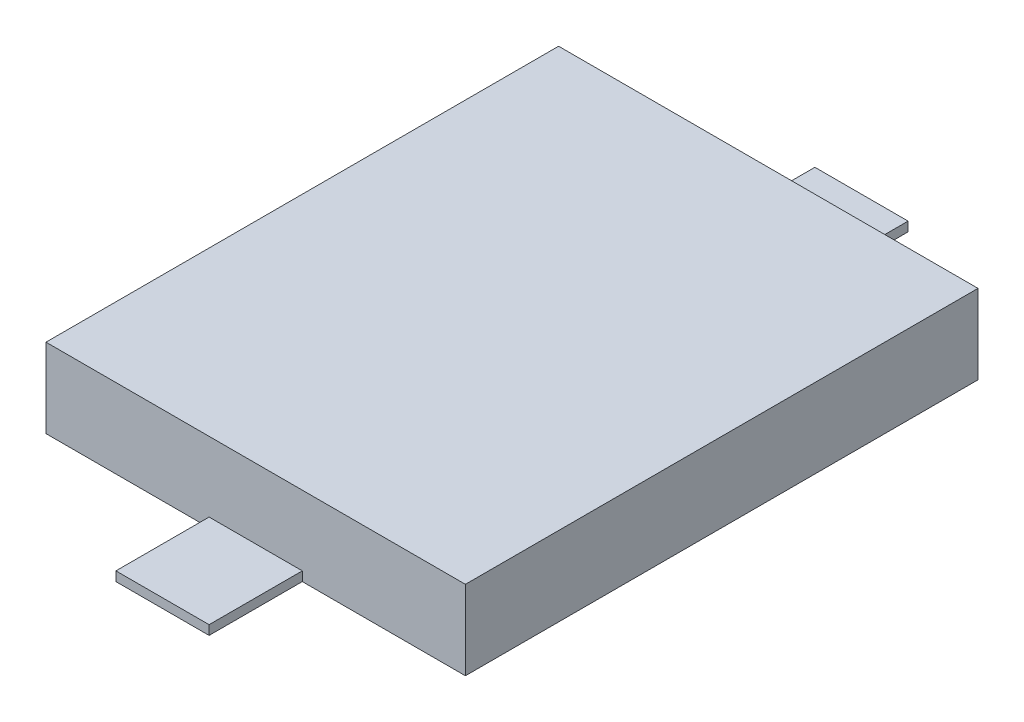
ISO-10303-21;
HEADER;
FILE_DESCRIPTION(('STEP AP214'),'2;1');
FILE_NAME('part.step','',(''),(''),'','','');
FILE_SCHEMA(('AUTOMOTIVE_DESIGN { 1 0 10303 214 1 1 1 1 }'));
ENDSEC;
DATA;
#1=APPLICATION_CONTEXT('core data for automotive mechanical design processes');
#2=APPLICATION_PROTOCOL_DEFINITION('international standard','automotive_design',2000,#1);
#3=PRODUCT_CONTEXT('',#1,'mechanical');
#4=PRODUCT('Part','Part','',(#3));
#5=PRODUCT_RELATED_PRODUCT_CATEGORY('part','',(#4));
#6=PRODUCT_DEFINITION_FORMATION('','',#4);
#7=PRODUCT_DEFINITION_CONTEXT('part definition',#1,'design');
#8=PRODUCT_DEFINITION('design','',#6,#7);
#9=PRODUCT_DEFINITION_SHAPE('','',#8);
#10=(LENGTH_UNIT() NAMED_UNIT(*) SI_UNIT(.MILLI.,.METRE.));
#11=(NAMED_UNIT(*) PLANE_ANGLE_UNIT() SI_UNIT($,.RADIAN.));
#12=(NAMED_UNIT(*) SI_UNIT($,.STERADIAN.) SOLID_ANGLE_UNIT());
#13=UNCERTAINTY_MEASURE_WITH_UNIT(LENGTH_MEASURE(1.E-05),#10,'distance_accuracy_value','');
#14=(GEOMETRIC_REPRESENTATION_CONTEXT(3) GLOBAL_UNCERTAINTY_ASSIGNED_CONTEXT((#13)) GLOBAL_UNIT_ASSIGNED_CONTEXT((#10,
#11,#12)) REPRESENTATION_CONTEXT('',''));
#15=CARTESIAN_POINT('',(0.,0.,0.));
#16=DIRECTION('',(0.,0.,1.));
#17=DIRECTION('',(1.,0.,0.));
#18=AXIS2_PLACEMENT_3D('',#15,#16,#17);
#19=CARTESIAN_POINT('',(-1.,0.2,-7.5));
#20=CARTESIAN_POINT('',(1.,0.2,-7.5));
#21=CARTESIAN_POINT('',(-1.,0.2,-5.5));
#22=CARTESIAN_POINT('',(1.,0.2,-5.5));
#23=(BOUNDED_SURFACE() B_SPLINE_SURFACE(1,1,((#19,#20),(#21,#22)),.UNSPECIFIED.,.F.,.F.,
.F.) B_SPLINE_SURFACE_WITH_KNOTS((2,2),(2,2),(-7.5,-5.5),(-1.,1.),
.UNSPECIFIED.) GEOMETRIC_REPRESENTATION_ITEM() RATIONAL_B_SPLINE_SURFACE(((1.,1.),(1.,1.))) REPRESENTATION_ITEM('') SURFACE());
#24=CARTESIAN_POINT('',(1.,0.2,-7.5));
#25=CARTESIAN_POINT('',(1.,0.2,-5.5));
#26=(BOUNDED_CURVE() B_SPLINE_CURVE(1,(#24,#25),.UNSPECIFIED.,.F.,
.F.) B_SPLINE_CURVE_WITH_KNOTS((2,2),(0.,2.),
.UNSPECIFIED.) CURVE() GEOMETRIC_REPRESENTATION_ITEM() RATIONAL_B_SPLINE_CURVE((1.,1.)) REPRESENTATION_ITEM(''));
#27=CARTESIAN_POINT('',(1.,0.2,-7.5));
#28=VERTEX_POINT('',#27);
#29=CARTESIAN_POINT('',(1.,0.2,-5.5));
#30=VERTEX_POINT('',#29);
#31=EDGE_CURVE('E211',#28,#30,#26,.T.);
#32=CARTESIAN_POINT('',(-1.,0.2,-7.5));
#33=CARTESIAN_POINT('',(1.,0.2,-7.5));
#34=(BOUNDED_CURVE() B_SPLINE_CURVE(1,(#32,#33),.UNSPECIFIED.,.F.,
.F.) B_SPLINE_CURVE_WITH_KNOTS((2,2),(0.,2.),
.UNSPECIFIED.) CURVE() GEOMETRIC_REPRESENTATION_ITEM() RATIONAL_B_SPLINE_CURVE((1.,1.)) REPRESENTATION_ITEM(''));
#35=CARTESIAN_POINT('',(-1.,0.2,-7.5));
#36=VERTEX_POINT('',#35);
#37=EDGE_CURVE('E32',#36,#28,#34,.T.);
#38=CARTESIAN_POINT('',(-1.,0.2,-5.5));
#39=CARTESIAN_POINT('',(-1.,0.2,-7.5));
#40=(BOUNDED_CURVE() B_SPLINE_CURVE(1,(#38,#39),.UNSPECIFIED.,.F.,
.F.) B_SPLINE_CURVE_WITH_KNOTS((2,2),(-2.,0.),
.UNSPECIFIED.) CURVE() GEOMETRIC_REPRESENTATION_ITEM() RATIONAL_B_SPLINE_CURVE((1.,1.)) REPRESENTATION_ITEM(''));
#41=CARTESIAN_POINT('',(-1.,0.2,-5.5));
#42=VERTEX_POINT('',#41);
#43=EDGE_CURVE('E11',#42,#36,#40,.T.);
#44=CARTESIAN_POINT('',(1.,0.2,-5.5));
#45=CARTESIAN_POINT('',(-1.,0.2,-5.5));
#46=(BOUNDED_CURVE() B_SPLINE_CURVE(1,(#44,#45),.UNSPECIFIED.,.F.,
.F.) B_SPLINE_CURVE_WITH_KNOTS((2,2),(-2.,0.),
.UNSPECIFIED.) CURVE() GEOMETRIC_REPRESENTATION_ITEM() RATIONAL_B_SPLINE_CURVE((1.,1.)) REPRESENTATION_ITEM(''));
#47=EDGE_CURVE('E23',#30,#42,#46,.T.);
#48=ORIENTED_EDGE('',*,*,#31,.F.);
#49=ORIENTED_EDGE('',*,*,#37,.F.);
#50=ORIENTED_EDGE('',*,*,#43,.F.);
#51=ORIENTED_EDGE('',*,*,#47,.F.);
#52=EDGE_LOOP('',(#48,#49,#50,#51));
#53=FACE_BOUND('',#52,.T.);
#54=ADVANCED_FACE('F17',(#53),#23,.T.);
#55=CARTESIAN_POINT('',(-1.,0.,-7.5));
#56=CARTESIAN_POINT('',(-1.,0.2,-7.5));
#57=CARTESIAN_POINT('',(-1.,0.,-5.5));
#58=CARTESIAN_POINT('',(-1.,0.2,-5.5));
#59=(BOUNDED_SURFACE() B_SPLINE_SURFACE(1,1,((#55,#56),(#57,#58)),.UNSPECIFIED.,.F.,.F.,
.F.) B_SPLINE_SURFACE_WITH_KNOTS((2,2),(2,2),(0.,2.),(-0.2,0.),
.UNSPECIFIED.) GEOMETRIC_REPRESENTATION_ITEM() RATIONAL_B_SPLINE_SURFACE(((1.,1.),(1.,1.))) REPRESENTATION_ITEM('') SURFACE());
#60=CARTESIAN_POINT('',(-1.,0.,-5.5));
#61=CARTESIAN_POINT('',(-1.,0.,-7.5));
#62=(BOUNDED_CURVE() B_SPLINE_CURVE(1,(#60,#61),.UNSPECIFIED.,.F.,
.F.) B_SPLINE_CURVE_WITH_KNOTS((2,2),(-2.,0.),
.UNSPECIFIED.) CURVE() GEOMETRIC_REPRESENTATION_ITEM() RATIONAL_B_SPLINE_CURVE((1.,1.)) REPRESENTATION_ITEM(''));
#63=CARTESIAN_POINT('',(-1.,0.,-5.5));
#64=VERTEX_POINT('',#63);
#65=CARTESIAN_POINT('',(-1.,0.,-7.5));
#66=VERTEX_POINT('',#65);
#67=EDGE_CURVE('E155',#64,#66,#62,.T.);
#68=CARTESIAN_POINT('',(-1.,0.2,-5.5));
#69=CARTESIAN_POINT('',(-1.,0.,-5.5));
#70=(BOUNDED_CURVE() B_SPLINE_CURVE(1,(#68,#69),.UNSPECIFIED.,.F.,
.F.) B_SPLINE_CURVE_WITH_KNOTS((2,2),(0.,0.2),
.UNSPECIFIED.) CURVE() GEOMETRIC_REPRESENTATION_ITEM() RATIONAL_B_SPLINE_CURVE((1.,1.)) REPRESENTATION_ITEM(''));
#71=EDGE_CURVE('E159',#42,#64,#70,.T.);
#72=CARTESIAN_POINT('',(-1.,0.2,-7.5));
#73=CARTESIAN_POINT('',(-1.,0.,-7.5));
#74=(BOUNDED_CURVE() B_SPLINE_CURVE(1,(#72,#73),.UNSPECIFIED.,.F.,
.F.) B_SPLINE_CURVE_WITH_KNOTS((2,2),(0.,0.2),
.UNSPECIFIED.) CURVE() GEOMETRIC_REPRESENTATION_ITEM() RATIONAL_B_SPLINE_CURVE((1.,1.)) REPRESENTATION_ITEM(''));
#75=EDGE_CURVE('E162',#36,#66,#74,.T.);
#76=ORIENTED_EDGE('',*,*,#67,.F.);
#77=ORIENTED_EDGE('',*,*,#71,.F.);
#78=ORIENTED_EDGE('',*,*,#43,.T.);
#79=ORIENTED_EDGE('',*,*,#75,.T.);
#80=EDGE_LOOP('',(#76,#77,#78,#79));
#81=FACE_BOUND('',#80,.T.);
#82=ADVANCED_FACE('F157',(#81),#59,.T.);
#83=CARTESIAN_POINT('',(1.,0.,-7.5));
#84=CARTESIAN_POINT('',(1.,0.2,-7.5));
#85=CARTESIAN_POINT('',(-1.,0.,-7.5));
#86=CARTESIAN_POINT('',(-1.,0.2,-7.5));
#87=(BOUNDED_SURFACE() B_SPLINE_SURFACE(1,1,((#83,#84),(#85,#86)),.UNSPECIFIED.,.F.,.F.,
.F.) B_SPLINE_SURFACE_WITH_KNOTS((2,2),(2,2),(-2.,0.),(-0.2,0.),
.UNSPECIFIED.) GEOMETRIC_REPRESENTATION_ITEM() RATIONAL_B_SPLINE_SURFACE(((1.,1.),(1.,1.))) REPRESENTATION_ITEM('') SURFACE());
#88=CARTESIAN_POINT('',(-1.,0.,-7.5));
#89=CARTESIAN_POINT('',(1.,0.,-7.5));
#90=(BOUNDED_CURVE() B_SPLINE_CURVE(1,(#88,#89),.UNSPECIFIED.,.F.,
.F.) B_SPLINE_CURVE_WITH_KNOTS((2,2),(0.,2.),
.UNSPECIFIED.) CURVE() GEOMETRIC_REPRESENTATION_ITEM() RATIONAL_B_SPLINE_CURVE((1.,1.)) REPRESENTATION_ITEM(''));
#91=CARTESIAN_POINT('',(1.,0.,-7.5));
#92=VERTEX_POINT('',#91);
#93=EDGE_CURVE('E167',#66,#92,#90,.T.);
#94=CARTESIAN_POINT('',(1.,0.2,-7.5));
#95=CARTESIAN_POINT('',(1.,0.,-7.5));
#96=(BOUNDED_CURVE() B_SPLINE_CURVE(1,(#94,#95),.UNSPECIFIED.,.F.,
.F.) B_SPLINE_CURVE_WITH_KNOTS((2,2),(0.,0.2),
.UNSPECIFIED.) CURVE() GEOMETRIC_REPRESENTATION_ITEM() RATIONAL_B_SPLINE_CURVE((1.,1.)) REPRESENTATION_ITEM(''));
#97=EDGE_CURVE('E219',#28,#92,#96,.T.);
#98=ORIENTED_EDGE('',*,*,#93,.F.);
#99=ORIENTED_EDGE('',*,*,#75,.F.);
#100=ORIENTED_EDGE('',*,*,#37,.T.);
#101=ORIENTED_EDGE('',*,*,#97,.T.);
#102=EDGE_LOOP('',(#98,#99,#100,#101));
#103=FACE_BOUND('',#102,.T.);
#104=ADVANCED_FACE('F486',(#103),#87,.T.);
#105=CARTESIAN_POINT('',(1.,0.,-5.5));
#106=CARTESIAN_POINT('',(1.,0.2,-5.5));
#107=CARTESIAN_POINT('',(1.,0.,-7.5));
#108=CARTESIAN_POINT('',(1.,0.2,-7.5));
#109=(BOUNDED_SURFACE() B_SPLINE_SURFACE(1,1,((#105,#106),(#107,#108)),.UNSPECIFIED.,.F.,.F.,
.F.) B_SPLINE_SURFACE_WITH_KNOTS((2,2),(2,2),(-2.,0.),(-0.2,0.),
.UNSPECIFIED.) GEOMETRIC_REPRESENTATION_ITEM() RATIONAL_B_SPLINE_SURFACE(((1.,1.),(1.,1.))) REPRESENTATION_ITEM('') SURFACE());
#110=CARTESIAN_POINT('',(1.,0.,-7.5));
#111=CARTESIAN_POINT('',(1.,0.,-5.5));
#112=(BOUNDED_CURVE() B_SPLINE_CURVE(1,(#110,#111),.UNSPECIFIED.,.F.,
.F.) B_SPLINE_CURVE_WITH_KNOTS((2,2),(0.,2.),
.UNSPECIFIED.) CURVE() GEOMETRIC_REPRESENTATION_ITEM() RATIONAL_B_SPLINE_CURVE((1.,1.)) REPRESENTATION_ITEM(''));
#113=CARTESIAN_POINT('',(1.,0.,-5.5));
#114=VERTEX_POINT('',#113);
#115=EDGE_CURVE('E199',#92,#114,#112,.T.);
#116=CARTESIAN_POINT('',(1.,0.2,-5.5));
#117=CARTESIAN_POINT('',(1.,0.,-5.5));
#118=(BOUNDED_CURVE() B_SPLINE_CURVE(1,(#116,#117),.UNSPECIFIED.,.F.,
.F.) B_SPLINE_CURVE_WITH_KNOTS((2,2),(0.,0.2),
.UNSPECIFIED.) CURVE() GEOMETRIC_REPRESENTATION_ITEM() RATIONAL_B_SPLINE_CURVE((1.,1.)) REPRESENTATION_ITEM(''));
#119=EDGE_CURVE('E190',#30,#114,#118,.T.);
#120=ORIENTED_EDGE('',*,*,#115,.F.);
#121=ORIENTED_EDGE('',*,*,#97,.F.);
#122=ORIENTED_EDGE('',*,*,#31,.T.);
#123=ORIENTED_EDGE('',*,*,#119,.T.);
#124=EDGE_LOOP('',(#120,#121,#122,#123));
#125=FACE_BOUND('',#124,.T.);
#126=ADVANCED_FACE('F449',(#125),#109,.T.);
#127=CARTESIAN_POINT('',(-1.,0.2,7.5));
#128=CARTESIAN_POINT('',(1.,0.2,7.5));
#129=CARTESIAN_POINT('',(-1.,0.2,5.5));
#130=CARTESIAN_POINT('',(1.,0.2,5.5));
#131=(BOUNDED_SURFACE() B_SPLINE_SURFACE(1,1,((#127,#128),(#129,#130)),.UNSPECIFIED.,.F.,.F.,
.F.) B_SPLINE_SURFACE_WITH_KNOTS((2,2),(2,2),(-7.5,-5.5),(-1.,1.),
.UNSPECIFIED.) GEOMETRIC_REPRESENTATION_ITEM() RATIONAL_B_SPLINE_SURFACE(((1.,1.),(1.,1.))) REPRESENTATION_ITEM('') SURFACE());
#132=CARTESIAN_POINT('',(1.,0.2,5.5));
#133=CARTESIAN_POINT('',(1.,0.2,7.5));
#134=(BOUNDED_CURVE() B_SPLINE_CURVE(1,(#132,#133),.UNSPECIFIED.,.F.,
.F.) B_SPLINE_CURVE_WITH_KNOTS((2,2),(-2.,0.),
.UNSPECIFIED.) CURVE() GEOMETRIC_REPRESENTATION_ITEM() RATIONAL_B_SPLINE_CURVE((1.,1.)) REPRESENTATION_ITEM(''));
#135=CARTESIAN_POINT('',(1.,0.2,5.5));
#136=VERTEX_POINT('',#135);
#137=CARTESIAN_POINT('',(1.,0.2,7.5));
#138=VERTEX_POINT('',#137);
#139=EDGE_CURVE('E96',#136,#138,#134,.T.);
#140=CARTESIAN_POINT('',(-1.,0.2,5.5));
#141=CARTESIAN_POINT('',(1.,0.2,5.5));
#142=(BOUNDED_CURVE() B_SPLINE_CURVE(1,(#140,#141),.UNSPECIFIED.,.F.,
.F.) B_SPLINE_CURVE_WITH_KNOTS((2,2),(0.,2.),
.UNSPECIFIED.) CURVE() GEOMETRIC_REPRESENTATION_ITEM() RATIONAL_B_SPLINE_CURVE((1.,1.)) REPRESENTATION_ITEM(''));
#143=CARTESIAN_POINT('',(-1.,0.2,5.5));
#144=VERTEX_POINT('',#143);
#145=EDGE_CURVE('E243',#144,#136,#142,.T.);
#146=CARTESIAN_POINT('',(-1.,0.2,7.5));
#147=CARTESIAN_POINT('',(-1.,0.2,5.5));
#148=(BOUNDED_CURVE() B_SPLINE_CURVE(1,(#146,#147),.UNSPECIFIED.,.F.,
.F.) B_SPLINE_CURVE_WITH_KNOTS((2,2),(0.,2.),
.UNSPECIFIED.) CURVE() GEOMETRIC_REPRESENTATION_ITEM() RATIONAL_B_SPLINE_CURVE((1.,1.)) REPRESENTATION_ITEM(''));
#149=CARTESIAN_POINT('',(-1.,0.2,7.5));
#150=VERTEX_POINT('',#149);
#151=EDGE_CURVE('E149',#150,#144,#148,.T.);
#152=CARTESIAN_POINT('',(1.,0.2,7.5));
#153=CARTESIAN_POINT('',(-1.,0.2,7.5));
#154=(BOUNDED_CURVE() B_SPLINE_CURVE(1,(#152,#153),.UNSPECIFIED.,.F.,
.F.) B_SPLINE_CURVE_WITH_KNOTS((2,2),(-2.,0.),
.UNSPECIFIED.) CURVE() GEOMETRIC_REPRESENTATION_ITEM() RATIONAL_B_SPLINE_CURVE((1.,1.)) REPRESENTATION_ITEM(''));
#155=EDGE_CURVE('E220',#138,#150,#154,.T.);
#156=ORIENTED_EDGE('',*,*,#139,.F.);
#157=ORIENTED_EDGE('',*,*,#145,.F.);
#158=ORIENTED_EDGE('',*,*,#151,.F.);
#159=ORIENTED_EDGE('',*,*,#155,.F.);
#160=EDGE_LOOP('',(#156,#157,#158,#159));
#161=FACE_BOUND('',#160,.T.);
#162=ADVANCED_FACE('F495',(#161),#131,.F.);
#163=CARTESIAN_POINT('',(-1.,0.,7.5));
#164=CARTESIAN_POINT('',(-1.,0.2,7.5));
#165=CARTESIAN_POINT('',(1.,0.,7.5));
#166=CARTESIAN_POINT('',(1.,0.2,7.5));
#167=(BOUNDED_SURFACE() B_SPLINE_SURFACE(1,1,((#163,#164),(#165,#166)),.UNSPECIFIED.,.F.,.F.,
.F.) B_SPLINE_SURFACE_WITH_KNOTS((2,2),(2,2),(0.,2.),(-0.2,0.),
.UNSPECIFIED.) GEOMETRIC_REPRESENTATION_ITEM() RATIONAL_B_SPLINE_SURFACE(((1.,1.),(1.,1.))) REPRESENTATION_ITEM('') SURFACE());
#168=CARTESIAN_POINT('',(1.,0.,7.5));
#169=CARTESIAN_POINT('',(-1.,0.,7.5));
#170=(BOUNDED_CURVE() B_SPLINE_CURVE(1,(#168,#169),.UNSPECIFIED.,.F.,
.F.) B_SPLINE_CURVE_WITH_KNOTS((2,2),(-2.,0.),
.UNSPECIFIED.) CURVE() GEOMETRIC_REPRESENTATION_ITEM() RATIONAL_B_SPLINE_CURVE((1.,1.)) REPRESENTATION_ITEM(''));
#171=CARTESIAN_POINT('',(1.,0.,7.5));
#172=VERTEX_POINT('',#171);
#173=CARTESIAN_POINT('',(-1.,0.,7.5));
#174=VERTEX_POINT('',#173);
#175=EDGE_CURVE('E251',#172,#174,#170,.T.);
#176=CARTESIAN_POINT('',(1.,0.2,7.5));
#177=CARTESIAN_POINT('',(1.,0.,7.5));
#178=(BOUNDED_CURVE() B_SPLINE_CURVE(1,(#176,#177),.UNSPECIFIED.,.F.,
.F.) B_SPLINE_CURVE_WITH_KNOTS((2,2),(0.,0.2),
.UNSPECIFIED.) CURVE() GEOMETRIC_REPRESENTATION_ITEM() RATIONAL_B_SPLINE_CURVE((1.,1.)) REPRESENTATION_ITEM(''));
#179=EDGE_CURVE('E359',#138,#172,#178,.T.);
#180=CARTESIAN_POINT('',(-1.,0.2,7.5));
#181=CARTESIAN_POINT('',(-1.,0.,7.5));
#182=(BOUNDED_CURVE() B_SPLINE_CURVE(1,(#180,#181),.UNSPECIFIED.,.F.,
.F.) B_SPLINE_CURVE_WITH_KNOTS((2,2),(0.,0.2),
.UNSPECIFIED.) CURVE() GEOMETRIC_REPRESENTATION_ITEM() RATIONAL_B_SPLINE_CURVE((1.,1.)) REPRESENTATION_ITEM(''));
#183=EDGE_CURVE('E329',#150,#174,#182,.T.);
#184=ORIENTED_EDGE('',*,*,#175,.F.);
#185=ORIENTED_EDGE('',*,*,#179,.F.);
#186=ORIENTED_EDGE('',*,*,#155,.T.);
#187=ORIENTED_EDGE('',*,*,#183,.T.);
#188=EDGE_LOOP('',(#184,#185,#186,#187));
#189=FACE_BOUND('',#188,.T.);
#190=ADVANCED_FACE('F19',(#189),#167,.T.);
#191=CARTESIAN_POINT('',(-1.,0.,5.5));
#192=CARTESIAN_POINT('',(-1.,0.2,5.5));
#193=CARTESIAN_POINT('',(-1.,0.,7.5));
#194=CARTESIAN_POINT('',(-1.,0.2,7.5));
#195=(BOUNDED_SURFACE() B_SPLINE_SURFACE(1,1,((#191,#192),(#193,#194)),.UNSPECIFIED.,.F.,.F.,
.F.) B_SPLINE_SURFACE_WITH_KNOTS((2,2),(2,2),(-2.,0.),(-0.2,0.),
.UNSPECIFIED.) GEOMETRIC_REPRESENTATION_ITEM() RATIONAL_B_SPLINE_SURFACE(((1.,1.),(1.,1.))) REPRESENTATION_ITEM('') SURFACE());
#196=CARTESIAN_POINT('',(-1.,0.,7.5));
#197=CARTESIAN_POINT('',(-1.,0.,5.5));
#198=(BOUNDED_CURVE() B_SPLINE_CURVE(1,(#196,#197),.UNSPECIFIED.,.F.,
.F.) B_SPLINE_CURVE_WITH_KNOTS((2,2),(0.,2.),
.UNSPECIFIED.) CURVE() GEOMETRIC_REPRESENTATION_ITEM() RATIONAL_B_SPLINE_CURVE((1.,1.)) REPRESENTATION_ITEM(''));
#199=CARTESIAN_POINT('',(-1.,0.,5.5));
#200=VERTEX_POINT('',#199);
#201=EDGE_CURVE('E168',#174,#200,#198,.T.);
#202=CARTESIAN_POINT('',(-1.,0.2,5.5));
#203=CARTESIAN_POINT('',(-1.,0.,5.5));
#204=(BOUNDED_CURVE() B_SPLINE_CURVE(1,(#202,#203),.UNSPECIFIED.,.F.,
.F.) B_SPLINE_CURVE_WITH_KNOTS((2,2),(0.,0.2),
.UNSPECIFIED.) CURVE() GEOMETRIC_REPRESENTATION_ITEM() RATIONAL_B_SPLINE_CURVE((1.,1.)) REPRESENTATION_ITEM(''));
#205=EDGE_CURVE('E351',#144,#200,#204,.T.);
#206=ORIENTED_EDGE('',*,*,#201,.F.);
#207=ORIENTED_EDGE('',*,*,#183,.F.);
#208=ORIENTED_EDGE('',*,*,#151,.T.);
#209=ORIENTED_EDGE('',*,*,#205,.T.);
#210=EDGE_LOOP('',(#206,#207,#208,#209));
#211=FACE_BOUND('',#210,.T.);
#212=ADVANCED_FACE('F439',(#211),#195,.T.);
#213=CARTESIAN_POINT('',(1.,0.,7.5));
#214=CARTESIAN_POINT('',(1.,0.2,7.5));
#215=CARTESIAN_POINT('',(1.,0.,5.5));
#216=CARTESIAN_POINT('',(1.,0.2,5.5));
#217=(BOUNDED_SURFACE() B_SPLINE_SURFACE(1,1,((#213,#214),(#215,#216)),.UNSPECIFIED.,.F.,.F.,
.F.) B_SPLINE_SURFACE_WITH_KNOTS((2,2),(2,2),(0.,2.),(-0.2,0.),
.UNSPECIFIED.) GEOMETRIC_REPRESENTATION_ITEM() RATIONAL_B_SPLINE_SURFACE(((1.,1.),(1.,1.))) REPRESENTATION_ITEM('') SURFACE());
#218=CARTESIAN_POINT('',(1.,0.,5.5));
#219=CARTESIAN_POINT('',(1.,0.,7.5));
#220=(BOUNDED_CURVE() B_SPLINE_CURVE(1,(#218,#219),.UNSPECIFIED.,.F.,
.F.) B_SPLINE_CURVE_WITH_KNOTS((2,2),(-2.,0.),
.UNSPECIFIED.) CURVE() GEOMETRIC_REPRESENTATION_ITEM() RATIONAL_B_SPLINE_CURVE((1.,1.)) REPRESENTATION_ITEM(''));
#221=CARTESIAN_POINT('',(1.,0.,5.5));
#222=VERTEX_POINT('',#221);
#223=EDGE_CURVE('E82',#222,#172,#220,.T.);
#224=CARTESIAN_POINT('',(1.,0.2,5.5));
#225=CARTESIAN_POINT('',(1.,0.,5.5));
#226=(BOUNDED_CURVE() B_SPLINE_CURVE(1,(#224,#225),.UNSPECIFIED.,.F.,
.F.) B_SPLINE_CURVE_WITH_KNOTS((2,2),(0.,0.2),
.UNSPECIFIED.) CURVE() GEOMETRIC_REPRESENTATION_ITEM() RATIONAL_B_SPLINE_CURVE((1.,1.)) REPRESENTATION_ITEM(''));
#227=EDGE_CURVE('E233',#136,#222,#226,.T.);
#228=ORIENTED_EDGE('',*,*,#223,.F.);
#229=ORIENTED_EDGE('',*,*,#227,.F.);
#230=ORIENTED_EDGE('',*,*,#139,.T.);
#231=ORIENTED_EDGE('',*,*,#179,.T.);
#232=EDGE_LOOP('',(#228,#229,#230,#231));
#233=FACE_BOUND('',#232,.T.);
#234=ADVANCED_FACE('F433',(#233),#217,.T.);
#235=CARTESIAN_POINT('',(-4.5,0.,7.5));
#236=CARTESIAN_POINT('',(4.5,0.,7.5));
#237=CARTESIAN_POINT('',(-4.5,0.,-7.5));
#238=CARTESIAN_POINT('',(4.5,0.,-7.5));
#239=(BOUNDED_SURFACE() B_SPLINE_SURFACE(1,1,((#235,#236),(#237,#238)),.UNSPECIFIED.,.F.,.F.,
.F.) B_SPLINE_SURFACE_WITH_KNOTS((2,2),(2,2),(-7.5,7.5),(-4.5,4.5),
.UNSPECIFIED.) GEOMETRIC_REPRESENTATION_ITEM() RATIONAL_B_SPLINE_SURFACE(((1.,1.),(1.,1.))) REPRESENTATION_ITEM('') SURFACE());
#240=CARTESIAN_POINT('',(4.5,0.,5.5));
#241=CARTESIAN_POINT('',(4.5,0.,-5.5));
#242=(BOUNDED_CURVE() B_SPLINE_CURVE(1,(#240,#241),.UNSPECIFIED.,.F.,
.F.) B_SPLINE_CURVE_WITH_KNOTS((2,2),(0.,11.),
.UNSPECIFIED.) CURVE() GEOMETRIC_REPRESENTATION_ITEM() RATIONAL_B_SPLINE_CURVE((1.,1.)) REPRESENTATION_ITEM(''));
#243=CARTESIAN_POINT('',(4.5,0.,5.5));
#244=VERTEX_POINT('',#243);
#245=CARTESIAN_POINT('',(4.5,0.,-5.5));
#246=VERTEX_POINT('',#245);
#247=EDGE_CURVE('E139',#244,#246,#242,.T.);
#248=CARTESIAN_POINT('',(1.,0.,5.5));
#249=CARTESIAN_POINT('',(4.5,0.,5.5));
#250=(BOUNDED_CURVE() B_SPLINE_CURVE(1,(#248,#249),.UNSPECIFIED.,.F.,
.F.) B_SPLINE_CURVE_WITH_KNOTS((2,2),(5.5,9.),
.UNSPECIFIED.) CURVE() GEOMETRIC_REPRESENTATION_ITEM() RATIONAL_B_SPLINE_CURVE((1.,1.)) REPRESENTATION_ITEM(''));
#251=EDGE_CURVE('E242',#222,#244,#250,.T.);
#252=CARTESIAN_POINT('',(-4.5,0.,5.5));
#253=CARTESIAN_POINT('',(-1.,0.,5.5));
#254=(BOUNDED_CURVE() B_SPLINE_CURVE(1,(#252,#253),.UNSPECIFIED.,.F.,
.F.) B_SPLINE_CURVE_WITH_KNOTS((2,2),(0.,3.5),
.UNSPECIFIED.) CURVE() GEOMETRIC_REPRESENTATION_ITEM() RATIONAL_B_SPLINE_CURVE((1.,1.)) REPRESENTATION_ITEM(''));
#255=CARTESIAN_POINT('',(-4.5,0.,5.5));
#256=VERTEX_POINT('',#255);
#257=EDGE_CURVE('E315',#256,#200,#254,.T.);
#258=CARTESIAN_POINT('',(-4.5,0.,-5.5));
#259=CARTESIAN_POINT('',(-4.5,0.,5.5));
#260=(BOUNDED_CURVE() B_SPLINE_CURVE(1,(#258,#259),.UNSPECIFIED.,.F.,
.F.) B_SPLINE_CURVE_WITH_KNOTS((2,2),(-11.,0.),
.UNSPECIFIED.) CURVE() GEOMETRIC_REPRESENTATION_ITEM() RATIONAL_B_SPLINE_CURVE((1.,1.)) REPRESENTATION_ITEM(''));
#261=CARTESIAN_POINT('',(-4.5,0.,-5.5));
#262=VERTEX_POINT('',#261);
#263=EDGE_CURVE('E174',#262,#256,#260,.T.);
#264=CARTESIAN_POINT('',(-1.,0.,-5.5));
#265=CARTESIAN_POINT('',(-4.5,0.,-5.5));
#266=(BOUNDED_CURVE() B_SPLINE_CURVE(1,(#264,#265),.UNSPECIFIED.,.F.,
.F.) B_SPLINE_CURVE_WITH_KNOTS((2,2),(-3.5,0.),
.UNSPECIFIED.) CURVE() GEOMETRIC_REPRESENTATION_ITEM() RATIONAL_B_SPLINE_CURVE((1.,1.)) REPRESENTATION_ITEM(''));
#267=EDGE_CURVE('E171',#64,#262,#266,.T.);
#268=CARTESIAN_POINT('',(4.5,0.,-5.5));
#269=CARTESIAN_POINT('',(1.,0.,-5.5));
#270=(BOUNDED_CURVE() B_SPLINE_CURVE(1,(#268,#269),.UNSPECIFIED.,.F.,
.F.) B_SPLINE_CURVE_WITH_KNOTS((2,2),(-9.,-5.5),
.UNSPECIFIED.) CURVE() GEOMETRIC_REPRESENTATION_ITEM() RATIONAL_B_SPLINE_CURVE((1.,1.)) REPRESENTATION_ITEM(''));
#271=EDGE_CURVE('E195',#246,#114,#270,.T.);
#272=ORIENTED_EDGE('',*,*,#247,.F.);
#273=ORIENTED_EDGE('',*,*,#251,.F.);
#274=ORIENTED_EDGE('',*,*,#223,.T.);
#275=ORIENTED_EDGE('',*,*,#175,.T.);
#276=ORIENTED_EDGE('',*,*,#201,.T.);
#277=ORIENTED_EDGE('',*,*,#257,.F.);
#278=ORIENTED_EDGE('',*,*,#263,.F.);
#279=ORIENTED_EDGE('',*,*,#267,.F.);
#280=ORIENTED_EDGE('',*,*,#67,.T.);
#281=ORIENTED_EDGE('',*,*,#93,.T.);
#282=ORIENTED_EDGE('',*,*,#115,.T.);
#283=ORIENTED_EDGE('',*,*,#271,.F.);
#284=EDGE_LOOP('',(#272,#273,#274,#275,#276,#277,#278,#279,#280,#281,#282,#283));
#285=FACE_BOUND('',#284,.T.);
#286=ADVANCED_FACE('F172',(#285),#239,.T.);
#287=CARTESIAN_POINT('',(-4.5,1.7,5.5));
#288=CARTESIAN_POINT('',(4.5,1.7,5.5));
#289=CARTESIAN_POINT('',(-4.5,1.7,-5.5));
#290=CARTESIAN_POINT('',(4.5,1.7,-5.5));
#291=(BOUNDED_SURFACE() B_SPLINE_SURFACE(1,1,((#287,#288),(#289,#290)),.UNSPECIFIED.,.F.,.F.,
.F.) B_SPLINE_SURFACE_WITH_KNOTS((2,2),(2,2),(-5.5,5.5),(-4.5,4.5),
.UNSPECIFIED.) GEOMETRIC_REPRESENTATION_ITEM() RATIONAL_B_SPLINE_SURFACE(((1.,1.),(1.,1.))) REPRESENTATION_ITEM('') SURFACE());
#292=CARTESIAN_POINT('',(4.5,1.7,5.5));
#293=CARTESIAN_POINT('',(4.5,1.7,-5.5));
#294=(BOUNDED_CURVE() B_SPLINE_CURVE(1,(#292,#293),.UNSPECIFIED.,.F.,
.F.) B_SPLINE_CURVE_WITH_KNOTS((2,2),(0.,11.),
.UNSPECIFIED.) CURVE() GEOMETRIC_REPRESENTATION_ITEM() RATIONAL_B_SPLINE_CURVE((1.,1.)) REPRESENTATION_ITEM(''));
#295=CARTESIAN_POINT('',(4.5,1.7,5.5));
#296=VERTEX_POINT('',#295);
#297=CARTESIAN_POINT('',(4.5,1.7,-5.5));
#298=VERTEX_POINT('',#297);
#299=EDGE_CURVE('E373',#296,#298,#294,.T.);
#300=CARTESIAN_POINT('',(4.5,1.7,-5.5));
#301=CARTESIAN_POINT('',(-4.5,1.7,-5.5));
#302=(BOUNDED_CURVE() B_SPLINE_CURVE(1,(#300,#301),.UNSPECIFIED.,.F.,
.F.) B_SPLINE_CURVE_WITH_KNOTS((2,2),(-9.,0.),
.UNSPECIFIED.) CURVE() GEOMETRIC_REPRESENTATION_ITEM() RATIONAL_B_SPLINE_CURVE((1.,1.)) REPRESENTATION_ITEM(''));
#303=CARTESIAN_POINT('',(-4.5,1.7,-5.5));
#304=VERTEX_POINT('',#303);
#305=EDGE_CURVE('E276',#298,#304,#302,.T.);
#306=CARTESIAN_POINT('',(-4.5,1.7,-5.5));
#307=CARTESIAN_POINT('',(-4.5,1.7,5.5));
#308=(BOUNDED_CURVE() B_SPLINE_CURVE(1,(#306,#307),.UNSPECIFIED.,.F.,
.F.) B_SPLINE_CURVE_WITH_KNOTS((2,2),(-11.,0.),
.UNSPECIFIED.) CURVE() GEOMETRIC_REPRESENTATION_ITEM() RATIONAL_B_SPLINE_CURVE((1.,1.)) REPRESENTATION_ITEM(''));
#309=CARTESIAN_POINT('',(-4.5,1.7,5.5));
#310=VERTEX_POINT('',#309);
#311=EDGE_CURVE('E336',#304,#310,#308,.T.);
#312=CARTESIAN_POINT('',(-4.5,1.7,5.5));
#313=CARTESIAN_POINT('',(4.5,1.7,5.5));
#314=(BOUNDED_CURVE() B_SPLINE_CURVE(1,(#312,#313),.UNSPECIFIED.,.F.,
.F.) B_SPLINE_CURVE_WITH_KNOTS((2,2),(0.,9.),
.UNSPECIFIED.) CURVE() GEOMETRIC_REPRESENTATION_ITEM() RATIONAL_B_SPLINE_CURVE((1.,1.)) REPRESENTATION_ITEM(''));
#315=EDGE_CURVE('E260',#310,#296,#314,.T.);
#316=ORIENTED_EDGE('',*,*,#299,.T.);
#317=ORIENTED_EDGE('',*,*,#305,.T.);
#318=ORIENTED_EDGE('',*,*,#311,.T.);
#319=ORIENTED_EDGE('',*,*,#315,.T.);
#320=EDGE_LOOP('',(#316,#317,#318,#319));
#321=FACE_BOUND('',#320,.T.);
#322=ADVANCED_FACE('F443',(#321),#291,.F.);
#323=CARTESIAN_POINT('',(-4.5,0.,5.5));
#324=CARTESIAN_POINT('',(-4.5,1.7,5.5));
#325=CARTESIAN_POINT('',(-4.5,0.,-5.5));
#326=CARTESIAN_POINT('',(-4.5,1.7,-5.5));
#327=(BOUNDED_SURFACE() B_SPLINE_SURFACE(1,1,((#323,#324),(#325,#326)),.UNSPECIFIED.,.F.,.F.,
.F.) B_SPLINE_SURFACE_WITH_KNOTS((2,2),(2,2),(0.,11.),(-1.7,0.),
.UNSPECIFIED.) GEOMETRIC_REPRESENTATION_ITEM() RATIONAL_B_SPLINE_SURFACE(((1.,1.),(1.,1.))) REPRESENTATION_ITEM('') SURFACE());
#328=CARTESIAN_POINT('',(-4.5,1.7,5.5));
#329=CARTESIAN_POINT('',(-4.5,0.,5.5));
#330=(BOUNDED_CURVE() B_SPLINE_CURVE(1,(#328,#329),.UNSPECIFIED.,.F.,
.F.) B_SPLINE_CURVE_WITH_KNOTS((2,2),(0.,1.7),
.UNSPECIFIED.) CURVE() GEOMETRIC_REPRESENTATION_ITEM() RATIONAL_B_SPLINE_CURVE((1.,1.)) REPRESENTATION_ITEM(''));
#331=EDGE_CURVE('E268',#310,#256,#330,.T.);
#332=CARTESIAN_POINT('',(-4.5,1.7,-5.5));
#333=CARTESIAN_POINT('',(-4.5,0.,-5.5));
#334=(BOUNDED_CURVE() B_SPLINE_CURVE(1,(#332,#333),.UNSPECIFIED.,.F.,
.F.) B_SPLINE_CURVE_WITH_KNOTS((2,2),(0.,1.7),
.UNSPECIFIED.) CURVE() GEOMETRIC_REPRESENTATION_ITEM() RATIONAL_B_SPLINE_CURVE((1.,1.)) REPRESENTATION_ITEM(''));
#335=EDGE_CURVE('E179',#304,#262,#334,.T.);
#336=ORIENTED_EDGE('',*,*,#263,.T.);
#337=ORIENTED_EDGE('',*,*,#331,.F.);
#338=ORIENTED_EDGE('',*,*,#311,.F.);
#339=ORIENTED_EDGE('',*,*,#335,.T.);
#340=EDGE_LOOP('',(#336,#337,#338,#339));
#341=FACE_BOUND('',#340,.T.);
#342=ADVANCED_FACE('F442',(#341),#327,.F.);
#343=CARTESIAN_POINT('',(4.5,0.,-5.5));
#344=CARTESIAN_POINT('',(4.5,1.7,-5.5));
#345=CARTESIAN_POINT('',(4.5,0.,5.5));
#346=CARTESIAN_POINT('',(4.5,1.7,5.5));
#347=(BOUNDED_SURFACE() B_SPLINE_SURFACE(1,1,((#343,#344),(#345,#346)),.UNSPECIFIED.,.F.,.F.,
.F.) B_SPLINE_SURFACE_WITH_KNOTS((2,2),(2,2),(-11.,0.),(-1.7,0.),
.UNSPECIFIED.) GEOMETRIC_REPRESENTATION_ITEM() RATIONAL_B_SPLINE_SURFACE(((1.,1.),(1.,1.))) REPRESENTATION_ITEM('') SURFACE());
#348=CARTESIAN_POINT('',(4.5,1.7,-5.5));
#349=CARTESIAN_POINT('',(4.5,0.,-5.5));
#350=(BOUNDED_CURVE() B_SPLINE_CURVE(1,(#348,#349),.UNSPECIFIED.,.F.,
.F.) B_SPLINE_CURVE_WITH_KNOTS((2,2),(0.,1.7),
.UNSPECIFIED.) CURVE() GEOMETRIC_REPRESENTATION_ITEM() RATIONAL_B_SPLINE_CURVE((1.,1.)) REPRESENTATION_ITEM(''));
#351=EDGE_CURVE('E284',#298,#246,#350,.T.);
#352=CARTESIAN_POINT('',(4.5,1.7,5.5));
#353=CARTESIAN_POINT('',(4.5,0.,5.5));
#354=(BOUNDED_CURVE() B_SPLINE_CURVE(1,(#352,#353),.UNSPECIFIED.,.F.,
.F.) B_SPLINE_CURVE_WITH_KNOTS((2,2),(0.,1.7),
.UNSPECIFIED.) CURVE() GEOMETRIC_REPRESENTATION_ITEM() RATIONAL_B_SPLINE_CURVE((1.,1.)) REPRESENTATION_ITEM(''));
#355=EDGE_CURVE('E269',#296,#244,#354,.T.);
#356=ORIENTED_EDGE('',*,*,#247,.T.);
#357=ORIENTED_EDGE('',*,*,#351,.F.);
#358=ORIENTED_EDGE('',*,*,#299,.F.);
#359=ORIENTED_EDGE('',*,*,#355,.T.);
#360=EDGE_LOOP('',(#356,#357,#358,#359));
#361=FACE_BOUND('',#360,.T.);
#362=ADVANCED_FACE('F444',(#361),#347,.F.);
#363=CARTESIAN_POINT('',(4.5,0.,5.5));
#364=CARTESIAN_POINT('',(4.5,1.7,5.5));
#365=CARTESIAN_POINT('',(-4.5,0.,5.5));
#366=CARTESIAN_POINT('',(-4.5,1.7,5.5));
#367=(BOUNDED_SURFACE() B_SPLINE_SURFACE(1,1,((#363,#364),(#365,#366)),.UNSPECIFIED.,.F.,.F.,
.F.) B_SPLINE_SURFACE_WITH_KNOTS((2,2),(2,2),(-9.,0.),(-1.7,0.),
.UNSPECIFIED.) GEOMETRIC_REPRESENTATION_ITEM() RATIONAL_B_SPLINE_SURFACE(((1.,1.),(1.,1.))) REPRESENTATION_ITEM('') SURFACE());
#368=ORIENTED_EDGE('',*,*,#205,.F.);
#369=ORIENTED_EDGE('',*,*,#145,.T.);
#370=ORIENTED_EDGE('',*,*,#227,.T.);
#371=ORIENTED_EDGE('',*,*,#251,.T.);
#372=ORIENTED_EDGE('',*,*,#355,.F.);
#373=ORIENTED_EDGE('',*,*,#315,.F.);
#374=ORIENTED_EDGE('',*,*,#331,.T.);
#375=ORIENTED_EDGE('',*,*,#257,.T.);
#376=EDGE_LOOP('',(#368,#369,#370,#371,#372,#373,#374,#375));
#377=FACE_BOUND('',#376,.T.);
#378=ADVANCED_FACE('F432',(#377),#367,.F.);
#379=CARTESIAN_POINT('',(-4.5,0.,-5.5));
#380=CARTESIAN_POINT('',(-4.5,1.7,-5.5));
#381=CARTESIAN_POINT('',(4.5,0.,-5.5));
#382=CARTESIAN_POINT('',(4.5,1.7,-5.5));
#383=(BOUNDED_SURFACE() B_SPLINE_SURFACE(1,1,((#379,#380),(#381,#382)),.UNSPECIFIED.,.F.,.F.,
.F.) B_SPLINE_SURFACE_WITH_KNOTS((2,2),(2,2),(0.,9.),(-1.7,0.),
.UNSPECIFIED.) GEOMETRIC_REPRESENTATION_ITEM() RATIONAL_B_SPLINE_SURFACE(((1.,1.),(1.,1.))) REPRESENTATION_ITEM('') SURFACE());
#384=ORIENTED_EDGE('',*,*,#119,.F.);
#385=ORIENTED_EDGE('',*,*,#47,.T.);
#386=ORIENTED_EDGE('',*,*,#71,.T.);
#387=ORIENTED_EDGE('',*,*,#267,.T.);
#388=ORIENTED_EDGE('',*,*,#335,.F.);
#389=ORIENTED_EDGE('',*,*,#305,.F.);
#390=ORIENTED_EDGE('',*,*,#351,.T.);
#391=ORIENTED_EDGE('',*,*,#271,.T.);
#392=EDGE_LOOP('',(#384,#385,#386,#387,#388,#389,#390,#391));
#393=FACE_BOUND('',#392,.T.);
#394=ADVANCED_FACE('F182',(#393),#383,.F.);
#395=CLOSED_SHELL('',(#54,#82,#104,#126,#162,#190,#212,#234,#286,#322,#342,#362,#378,#394));
#396=MANIFOLD_SOLID_BREP('B1',#395);
#397=ADVANCED_BREP_SHAPE_REPRESENTATION('',(#18,#396),#14);
#398=SHAPE_DEFINITION_REPRESENTATION(#9,#397);
ENDSEC;
END-ISO-10303-21;
